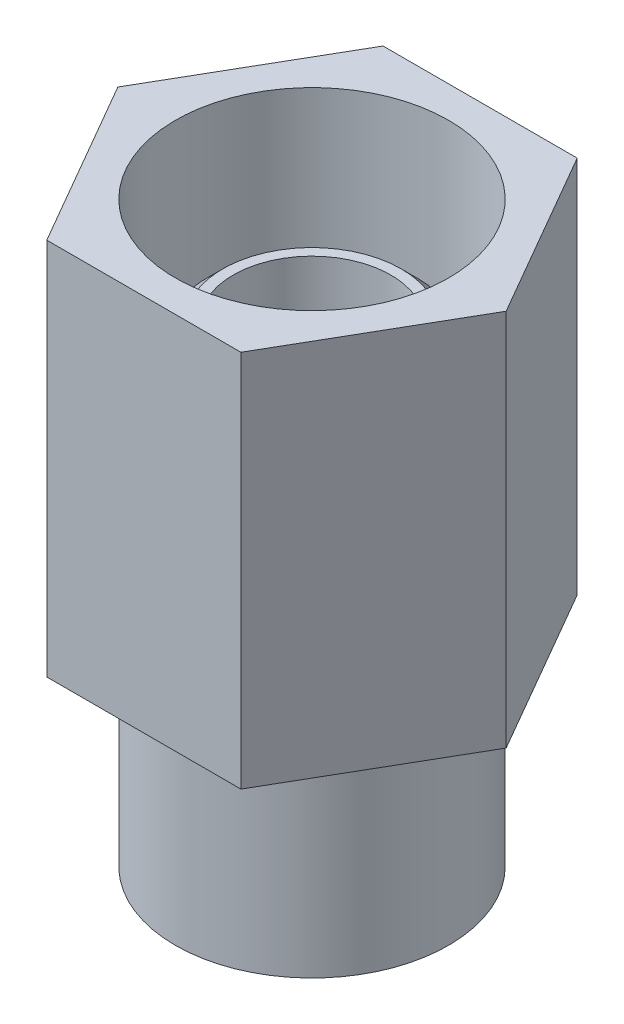
ISO-10303-21;
HEADER;
FILE_DESCRIPTION(('STEP AP214'),'2;1');
FILE_NAME('part.step','',(''),(''),'','','');
FILE_SCHEMA(('AUTOMOTIVE_DESIGN { 1 0 10303 214 1 1 1 1 }'));
ENDSEC;
DATA;
#1=APPLICATION_CONTEXT('core data for automotive mechanical design processes');
#2=APPLICATION_PROTOCOL_DEFINITION('international standard','automotive_design',2000,#1);
#3=PRODUCT_CONTEXT('',#1,'mechanical');
#4=PRODUCT('Part','Part','',(#3));
#5=PRODUCT_RELATED_PRODUCT_CATEGORY('part','',(#4));
#6=PRODUCT_DEFINITION_FORMATION('','',#4);
#7=PRODUCT_DEFINITION_CONTEXT('part definition',#1,'design');
#8=PRODUCT_DEFINITION('design','',#6,#7);
#9=PRODUCT_DEFINITION_SHAPE('','',#8);
#10=(LENGTH_UNIT() NAMED_UNIT(*) SI_UNIT(.MILLI.,.METRE.));
#11=(NAMED_UNIT(*) PLANE_ANGLE_UNIT() SI_UNIT($,.RADIAN.));
#12=(NAMED_UNIT(*) SI_UNIT($,.STERADIAN.) SOLID_ANGLE_UNIT());
#13=UNCERTAINTY_MEASURE_WITH_UNIT(LENGTH_MEASURE(1.E-05),#10,'distance_accuracy_value','');
#14=(GEOMETRIC_REPRESENTATION_CONTEXT(3) GLOBAL_UNCERTAINTY_ASSIGNED_CONTEXT((#13)) GLOBAL_UNIT_ASSIGNED_CONTEXT((#10,
#11,#12)) REPRESENTATION_CONTEXT('',''));
#15=CARTESIAN_POINT('',(0.,0.,0.));
#16=DIRECTION('',(0.,0.,1.));
#17=DIRECTION('',(1.,0.,0.));
#18=AXIS2_PLACEMENT_3D('',#15,#16,#17);
#19=CARTESIAN_POINT('',(0.,35.,0.));
#20=DIRECTION('',(0.,1.,0.));
#21=DIRECTION('',(0.,0.,1.));
#22=AXIS2_PLACEMENT_3D('',#19,#20,#21);
#23=PLANE('',#22);
#24=CARTESIAN_POINT('',(0.,35.,0.));
#25=DIRECTION('',(0.,1.,0.));
#26=DIRECTION('',(0.,0.,1.));
#27=AXIS2_PLACEMENT_3D('',#24,#25,#26);
#28=CIRCLE('',#27,10.);
#29=CARTESIAN_POINT('',(0.,35.,10.));
#30=VERTEX_POINT('',#29);
#31=EDGE_CURVE('E127',#30,#30,#28,.F.);
#32=ORIENTED_EDGE('',*,*,#31,.T.);
#33=EDGE_LOOP('',(#32));
#34=FACE_BOUND('',#33,.T.);
#35=CARTESIAN_POINT('',(0.,35.,0.));
#36=DIRECTION('',(0.,1.,0.));
#37=DIRECTION('',(0.,0.,1.));
#38=AXIS2_PLACEMENT_3D('',#35,#36,#37);
#39=CIRCLE('',#38,13.);
#40=CARTESIAN_POINT('',(0.,35.,-13.));
#41=VERTEX_POINT('',#40);
#42=EDGE_CURVE('E199',#41,#41,#39,.F.);
#43=ORIENTED_EDGE('',*,*,#42,.F.);
#44=EDGE_LOOP('',(#43));
#45=FACE_BOUND('',#44,.T.);
#46=ADVANCED_FACE('F49',(#34,#45),#23,.T.);
#47=CARTESIAN_POINT('',(0.,19.,0.));
#48=DIRECTION('',(0.,-1.,0.));
#49=DIRECTION('',(0.,0.,-1.));
#50=AXIS2_PLACEMENT_3D('',#47,#48,#49);
#51=CYLINDRICAL_SURFACE('',#50,7.5);
#52=CARTESIAN_POINT('',(0.,4.50000000000001,0.));
#53=DIRECTION('',(0.,1.,0.));
#54=DIRECTION('',(0.,0.,1.));
#55=AXIS2_PLACEMENT_3D('',#52,#53,#54);
#56=CIRCLE('',#55,7.5);
#57=CARTESIAN_POINT('',(0.,4.50000000000001,7.5));
#58=VERTEX_POINT('',#57);
#59=EDGE_CURVE('E195',#58,#58,#56,.F.);
#60=ORIENTED_EDGE('',*,*,#59,.T.);
#61=EDGE_LOOP('',(#60));
#62=FACE_BOUND('',#61,.T.);
#63=CARTESIAN_POINT('',(0.,45.,0.));
#64=DIRECTION('',(0.,1.,0.));
#65=DIRECTION('',(0.,0.,1.));
#66=AXIS2_PLACEMENT_3D('',#63,#64,#65);
#67=CIRCLE('',#66,7.5);
#68=CARTESIAN_POINT('',(0.,45.,7.5));
#69=VERTEX_POINT('',#68);
#70=EDGE_CURVE('E131',#69,#69,#67,.T.);
#71=ORIENTED_EDGE('',*,*,#70,.T.);
#72=EDGE_LOOP('',(#71));
#73=FACE_BOUND('',#72,.T.);
#74=ADVANCED_FACE('F218',(#62,#73),#51,.F.);
#75=CARTESIAN_POINT('',(0.,19.,0.));
#76=DIRECTION('',(0.,-1.,0.));
#77=DIRECTION('',(0.,0.,-1.));
#78=AXIS2_PLACEMENT_3D('',#75,#76,#77);
#79=CYLINDRICAL_SURFACE('',#78,13.);
#80=CARTESIAN_POINT('',(0.,19.,0.));
#81=DIRECTION('',(0.,1.,0.));
#82=DIRECTION('',(0.,0.,1.));
#83=AXIS2_PLACEMENT_3D('',#80,#81,#82);
#84=CIRCLE('',#83,13.);
#85=CARTESIAN_POINT('',(0.,19.,13.));
#86=VERTEX_POINT('',#85);
#87=EDGE_CURVE('E184',#86,#86,#84,.T.);
#88=ORIENTED_EDGE('',*,*,#87,.F.);
#89=EDGE_LOOP('',(#88));
#90=FACE_BOUND('',#89,.T.);
#91=CARTESIAN_POINT('',(0.,0.,0.));
#92=DIRECTION('',(0.,1.,0.));
#93=DIRECTION('',(0.,0.,1.));
#94=AXIS2_PLACEMENT_3D('',#91,#92,#93);
#95=CIRCLE('',#94,13.);
#96=CARTESIAN_POINT('',(0.,0.,13.));
#97=VERTEX_POINT('',#96);
#98=EDGE_CURVE('E183',#97,#97,#95,.T.);
#99=ORIENTED_EDGE('',*,*,#98,.T.);
#100=EDGE_LOOP('',(#99));
#101=FACE_BOUND('',#100,.T.);
#102=ADVANCED_FACE('F224',(#90,#101),#79,.T.);
#103=CARTESIAN_POINT('',(0.,0.,0.));
#104=DIRECTION('',(0.,1.,0.));
#105=DIRECTION('',(0.,0.,1.));
#106=AXIS2_PLACEMENT_3D('',#103,#104,#105);
#107=PLANE('',#106);
#108=CARTESIAN_POINT('',(0.,0.,0.));
#109=DIRECTION('',(0.,1.,0.));
#110=DIRECTION('',(0.,0.,1.));
#111=AXIS2_PLACEMENT_3D('',#108,#109,#110);
#112=CIRCLE('',#111,12.);
#113=CARTESIAN_POINT('',(0.,0.,12.));
#114=VERTEX_POINT('',#113);
#115=EDGE_CURVE('E188',#114,#114,#112,.T.);
#116=ORIENTED_EDGE('',*,*,#115,.T.);
#117=EDGE_LOOP('',(#116));
#118=FACE_BOUND('',#117,.T.);
#119=ORIENTED_EDGE('',*,*,#98,.F.);
#120=EDGE_LOOP('',(#119));
#121=FACE_BOUND('',#120,.T.);
#122=ADVANCED_FACE('F257',(#118,#121),#107,.F.);
#123=CARTESIAN_POINT('',(0.,0.,0.));
#124=DIRECTION('',(0.,-1.,0.));
#125=DIRECTION('',(0.,0.,-1.));
#126=AXIS2_PLACEMENT_3D('',#123,#124,#125);
#127=CONICAL_SURFACE('',#126,12.,0.785398163397446);
#128=ORIENTED_EDGE('',*,*,#59,.F.);
#129=EDGE_LOOP('',(#128));
#130=FACE_BOUND('',#129,.T.);
#131=ORIENTED_EDGE('',*,*,#115,.F.);
#132=EDGE_LOOP('',(#131));
#133=FACE_BOUND('',#132,.T.);
#134=ADVANCED_FACE('F256',(#130,#133),#127,.F.);
#135=CARTESIAN_POINT('',(-13.856406460551,35.,8.));
#136=DIRECTION('',(0.866025403784439,0.,-0.5));
#137=DIRECTION('',(-0.5,0.,-0.866025403784439));
#138=AXIS2_PLACEMENT_3D('',#135,#136,#137);
#139=PLANE('',#138);
#140=DIRECTION('',(0.,-1.,0.));
#141=VECTOR('',#140,1.);
#142=CARTESIAN_POINT('',(-18.475208614068,35.,0.));
#143=LINE('',#142,#141);
#144=CARTESIAN_POINT('',(-18.475208614068,55.,0.));
#145=VERTEX_POINT('',#144);
#146=CARTESIAN_POINT('',(-18.475208614068,19.,0.));
#147=VERTEX_POINT('',#146);
#148=EDGE_CURVE('E66',#145,#147,#143,.T.);
#149=ORIENTED_EDGE('',*,*,#148,.T.);
#150=DIRECTION('',(0.5,0.,0.866025403784439));
#151=VECTOR('',#150,1.);
#152=CARTESIAN_POINT('',(-13.856406460551,19.,8.));
#153=LINE('',#152,#151);
#154=CARTESIAN_POINT('',(-9.23760430703401,19.,16.));
#155=VERTEX_POINT('',#154);
#156=EDGE_CURVE('E150',#147,#155,#153,.T.);
#157=ORIENTED_EDGE('',*,*,#156,.T.);
#158=DIRECTION('',(0.,-1.,0.));
#159=VECTOR('',#158,1.);
#160=CARTESIAN_POINT('',(-9.23760430703401,35.,16.));
#161=LINE('',#160,#159);
#162=CARTESIAN_POINT('',(-9.23760430703394,55.,16.));
#163=VERTEX_POINT('',#162);
#164=EDGE_CURVE('E113',#163,#155,#161,.T.);
#165=ORIENTED_EDGE('',*,*,#164,.F.);
#166=DIRECTION('',(0.500000000000003,0.,0.866025403784437));
#167=VECTOR('',#166,1.);
#168=CARTESIAN_POINT('',(-13.856406460551,55.,8.00000000000004));
#169=LINE('',#168,#167);
#170=EDGE_CURVE('E111',#145,#163,#169,.T.);
#171=ORIENTED_EDGE('',*,*,#170,.F.);
#172=EDGE_LOOP('',(#149,#157,#165,#171));
#173=FACE_BOUND('',#172,.T.);
#174=ADVANCED_FACE('F112',(#173),#139,.F.);
#175=CARTESIAN_POINT('',(0.,35.,16.));
#176=DIRECTION('',(0.,0.,-1.));
#177=DIRECTION('',(-1.,0.,0.));
#178=AXIS2_PLACEMENT_3D('',#175,#176,#177);
#179=PLANE('',#178);
#180=ORIENTED_EDGE('',*,*,#164,.T.);
#181=DIRECTION('',(1.,0.,0.));
#182=VECTOR('',#181,1.);
#183=CARTESIAN_POINT('',(0.,19.,16.));
#184=LINE('',#183,#182);
#185=CARTESIAN_POINT('',(9.23760430703402,19.,16.));
#186=VERTEX_POINT('',#185);
#187=EDGE_CURVE('E153',#155,#186,#184,.T.);
#188=ORIENTED_EDGE('',*,*,#187,.T.);
#189=DIRECTION('',(0.,-1.,0.));
#190=VECTOR('',#189,1.);
#191=CARTESIAN_POINT('',(9.23760430703402,35.,16.));
#192=LINE('',#191,#190);
#193=CARTESIAN_POINT('',(9.23760430703412,55.,15.9999999999999));
#194=VERTEX_POINT('',#193);
#195=EDGE_CURVE('E178',#194,#186,#192,.T.);
#196=ORIENTED_EDGE('',*,*,#195,.F.);
#197=DIRECTION('',(1.,0.,0.));
#198=VECTOR('',#197,1.);
#199=CARTESIAN_POINT('',(0.,55.,16.));
#200=LINE('',#199,#198);
#201=EDGE_CURVE('E118',#163,#194,#200,.T.);
#202=ORIENTED_EDGE('',*,*,#201,.F.);
#203=EDGE_LOOP('',(#180,#188,#196,#202));
#204=FACE_BOUND('',#203,.T.);
#205=ADVANCED_FACE('F249',(#204),#179,.F.);
#206=CARTESIAN_POINT('',(13.856406460551,35.,8.00000000000001));
#207=DIRECTION('',(-0.866025403784439,0.,-0.5));
#208=DIRECTION('',(-0.5,0.,0.866025403784439));
#209=AXIS2_PLACEMENT_3D('',#206,#207,#208);
#210=PLANE('',#209);
#211=ORIENTED_EDGE('',*,*,#195,.T.);
#212=DIRECTION('',(0.5,0.,-0.866025403784439));
#213=VECTOR('',#212,1.);
#214=CARTESIAN_POINT('',(13.856406460551,19.,8.00000000000001));
#215=LINE('',#214,#213);
#216=CARTESIAN_POINT('',(18.475208614068,19.,0.));
#217=VERTEX_POINT('',#216);
#218=EDGE_CURVE('E157',#186,#217,#215,.T.);
#219=ORIENTED_EDGE('',*,*,#218,.T.);
#220=DIRECTION('',(0.,-1.,0.));
#221=VECTOR('',#220,1.);
#222=CARTESIAN_POINT('',(18.475208614068,35.,0.));
#223=LINE('',#222,#221);
#224=CARTESIAN_POINT('',(18.475208614068,55.,-1.6826817716975E-13));
#225=VERTEX_POINT('',#224);
#226=EDGE_CURVE('E175',#225,#217,#223,.T.);
#227=ORIENTED_EDGE('',*,*,#226,.F.);
#228=DIRECTION('',(0.499999999999993,0.,-0.866025403784443));
#229=VECTOR('',#228,1.);
#230=CARTESIAN_POINT('',(13.8564064605511,55.,7.99999999999988));
#231=LINE('',#230,#229);
#232=EDGE_CURVE('E137',#194,#225,#231,.T.);
#233=ORIENTED_EDGE('',*,*,#232,.F.);
#234=EDGE_LOOP('',(#211,#219,#227,#233));
#235=FACE_BOUND('',#234,.T.);
#236=ADVANCED_FACE('F245',(#235),#210,.F.);
#237=CARTESIAN_POINT('',(13.856406460551,35.,-8.));
#238=DIRECTION('',(-0.866025403784439,0.,0.5));
#239=DIRECTION('',(0.5,0.,0.866025403784439));
#240=AXIS2_PLACEMENT_3D('',#237,#238,#239);
#241=PLANE('',#240);
#242=ORIENTED_EDGE('',*,*,#226,.T.);
#243=DIRECTION('',(-0.5,0.,-0.866025403784439));
#244=VECTOR('',#243,1.);
#245=CARTESIAN_POINT('',(13.856406460551,19.,-8.));
#246=LINE('',#245,#244);
#247=CARTESIAN_POINT('',(9.23760430703402,19.,-16.));
#248=VERTEX_POINT('',#247);
#249=EDGE_CURVE('E161',#217,#248,#246,.T.);
#250=ORIENTED_EDGE('',*,*,#249,.T.);
#251=DIRECTION('',(0.,-1.,0.));
#252=VECTOR('',#251,1.);
#253=CARTESIAN_POINT('',(9.23760430703402,35.,-16.));
#254=LINE('',#253,#252);
#255=CARTESIAN_POINT('',(9.23760430703383,55.,-16.0000000000001));
#256=VERTEX_POINT('',#255);
#257=EDGE_CURVE('E172',#256,#248,#254,.T.);
#258=ORIENTED_EDGE('',*,*,#257,.F.);
#259=DIRECTION('',(-0.500000000000009,0.,-0.866025403784434));
#260=VECTOR('',#259,1.);
#261=CARTESIAN_POINT('',(13.8564064605509,55.,-8.00000000000013));
#262=LINE('',#261,#260);
#263=EDGE_CURVE('E141',#225,#256,#262,.T.);
#264=ORIENTED_EDGE('',*,*,#263,.F.);
#265=EDGE_LOOP('',(#242,#250,#258,#264));
#266=FACE_BOUND('',#265,.T.);
#267=ADVANCED_FACE('F241',(#266),#241,.F.);
#268=CARTESIAN_POINT('',(0.,35.,-16.));
#269=DIRECTION('',(0.,0.,1.));
#270=DIRECTION('',(1.,0.,0.));
#271=AXIS2_PLACEMENT_3D('',#268,#269,#270);
#272=PLANE('',#271);
#273=ORIENTED_EDGE('',*,*,#257,.T.);
#274=DIRECTION('',(-1.,0.,0.));
#275=VECTOR('',#274,1.);
#276=CARTESIAN_POINT('',(0.,19.,-16.));
#277=LINE('',#276,#275);
#278=CARTESIAN_POINT('',(-9.23760430703401,19.,-16.));
#279=VERTEX_POINT('',#278);
#280=EDGE_CURVE('E165',#248,#279,#277,.T.);
#281=ORIENTED_EDGE('',*,*,#280,.T.);
#282=DIRECTION('',(0.,-1.,0.));
#283=VECTOR('',#282,1.);
#284=CARTESIAN_POINT('',(-9.23760430703401,35.,-16.));
#285=LINE('',#284,#283);
#286=CARTESIAN_POINT('',(-9.23760430703401,55.,-16.));
#287=VERTEX_POINT('',#286);
#288=EDGE_CURVE('E73',#287,#279,#285,.T.);
#289=ORIENTED_EDGE('',*,*,#288,.F.);
#290=DIRECTION('',(-1.,0.,0.));
#291=VECTOR('',#290,1.);
#292=CARTESIAN_POINT('',(0.,55.,-16.0000000000001));
#293=LINE('',#292,#291);
#294=EDGE_CURVE('E125',#256,#287,#293,.T.);
#295=ORIENTED_EDGE('',*,*,#294,.F.);
#296=EDGE_LOOP('',(#273,#281,#289,#295));
#297=FACE_BOUND('',#296,.T.);
#298=ADVANCED_FACE('F238',(#297),#272,.F.);
#299=CARTESIAN_POINT('',(-13.856406460551,35.,-8.));
#300=DIRECTION('',(0.866025403784439,0.,0.5));
#301=DIRECTION('',(0.5,0.,-0.866025403784439));
#302=AXIS2_PLACEMENT_3D('',#299,#300,#301);
#303=PLANE('',#302);
#304=ORIENTED_EDGE('',*,*,#288,.T.);
#305=DIRECTION('',(-0.5,0.,0.866025403784439));
#306=VECTOR('',#305,1.);
#307=CARTESIAN_POINT('',(-13.856406460551,19.,-8.));
#308=LINE('',#307,#306);
#309=EDGE_CURVE('E106',#279,#147,#308,.T.);
#310=ORIENTED_EDGE('',*,*,#309,.T.);
#311=ORIENTED_EDGE('',*,*,#148,.F.);
#312=DIRECTION('',(-0.499999999999999,0.,0.866025403784439));
#313=VECTOR('',#312,1.);
#314=CARTESIAN_POINT('',(-13.856406460551,55.,-7.99999999999998));
#315=LINE('',#314,#313);
#316=EDGE_CURVE('E104',#287,#145,#315,.T.);
#317=ORIENTED_EDGE('',*,*,#316,.F.);
#318=EDGE_LOOP('',(#304,#310,#311,#317));
#319=FACE_BOUND('',#318,.T.);
#320=ADVANCED_FACE('F102',(#319),#303,.F.);
#321=CARTESIAN_POINT('',(0.,19.,0.));
#322=DIRECTION('',(0.,1.,0.));
#323=DIRECTION('',(0.,0.,1.));
#324=AXIS2_PLACEMENT_3D('',#321,#322,#323);
#325=PLANE('',#324);
#326=ORIENTED_EDGE('',*,*,#87,.T.);
#327=EDGE_LOOP('',(#326));
#328=FACE_BOUND('',#327,.T.);
#329=ORIENTED_EDGE('',*,*,#156,.F.);
#330=ORIENTED_EDGE('',*,*,#309,.F.);
#331=ORIENTED_EDGE('',*,*,#280,.F.);
#332=ORIENTED_EDGE('',*,*,#249,.F.);
#333=ORIENTED_EDGE('',*,*,#218,.F.);
#334=ORIENTED_EDGE('',*,*,#187,.F.);
#335=EDGE_LOOP('',(#329,#330,#331,#332,#333,#334));
#336=FACE_BOUND('',#335,.T.);
#337=ADVANCED_FACE('F232',(#328,#336),#325,.F.);
#338=CARTESIAN_POINT('',(0.,55.,0.));
#339=DIRECTION('',(0.,-1.,0.));
#340=DIRECTION('',(0.,0.,-1.));
#341=AXIS2_PLACEMENT_3D('',#338,#339,#340);
#342=CYLINDRICAL_SURFACE('',#341,13.);
#343=CARTESIAN_POINT('',(0.,55.,0.));
#344=DIRECTION('',(0.,1.,0.));
#345=DIRECTION('',(0.,0.,1.));
#346=AXIS2_PLACEMENT_3D('',#343,#344,#345);
#347=CIRCLE('',#346,13.);
#348=CARTESIAN_POINT('',(0.,55.,-13.));
#349=VERTEX_POINT('',#348);
#350=EDGE_CURVE('E146',#349,#349,#347,.T.);
#351=CARTESIAN_POINT('',(0.,35.,-13.));
#352=CARTESIAN_POINT('',(0.,35.2083333333333,-13.));
#353=CARTESIAN_POINT('',(0.,35.4166666666667,-13.));
#354=CARTESIAN_POINT('',(0.,35.8333333333333,-13.));
#355=CARTESIAN_POINT('',(0.,36.0416666666667,-13.));
#356=CARTESIAN_POINT('',(0.,36.4583333333333,-13.));
#357=CARTESIAN_POINT('',(0.,36.6666666666667,-13.));
#358=CARTESIAN_POINT('',(0.,37.0833333333333,-13.));
#359=CARTESIAN_POINT('',(0.,37.2916666666667,-13.));
#360=CARTESIAN_POINT('',(0.,37.7083333333333,-13.));
#361=CARTESIAN_POINT('',(0.,37.9166666666667,-13.));
#362=CARTESIAN_POINT('',(0.,38.3333333333333,-13.));
#363=CARTESIAN_POINT('',(0.,38.5416666666667,-13.));
#364=CARTESIAN_POINT('',(0.,38.9583333333333,-13.));
#365=CARTESIAN_POINT('',(0.,39.1666666666667,-13.));
#366=CARTESIAN_POINT('',(0.,39.5833333333333,-13.));
#367=CARTESIAN_POINT('',(0.,39.7916666666667,-13.));
#368=CARTESIAN_POINT('',(0.,40.2083333333333,-13.));
#369=CARTESIAN_POINT('',(0.,40.4166666666667,-13.));
#370=CARTESIAN_POINT('',(0.,40.8333333333333,-13.));
#371=CARTESIAN_POINT('',(0.,41.0416666666667,-13.));
#372=CARTESIAN_POINT('',(0.,41.4583333333333,-13.));
#373=CARTESIAN_POINT('',(0.,41.6666666666667,-13.));
#374=CARTESIAN_POINT('',(0.,42.0833333333333,-13.));
#375=CARTESIAN_POINT('',(0.,42.2916666666667,-13.));
#376=CARTESIAN_POINT('',(0.,42.7083333333333,-13.));
#377=CARTESIAN_POINT('',(0.,42.9166666666667,-13.));
#378=CARTESIAN_POINT('',(0.,43.3333333333333,-13.));
#379=CARTESIAN_POINT('',(0.,43.5416666666667,-13.));
#380=CARTESIAN_POINT('',(0.,43.9583333333333,-13.));
#381=CARTESIAN_POINT('',(0.,44.1666666666667,-13.));
#382=CARTESIAN_POINT('',(0.,44.5833333333333,-13.));
#383=CARTESIAN_POINT('',(0.,44.7916666666667,-13.));
#384=CARTESIAN_POINT('',(0.,45.2083333333333,-13.));
#385=CARTESIAN_POINT('',(0.,45.4166666666667,-13.));
#386=CARTESIAN_POINT('',(0.,45.8333333333333,-13.));
#387=CARTESIAN_POINT('',(0.,46.0416666666667,-13.));
#388=CARTESIAN_POINT('',(0.,46.4583333333333,-13.));
#389=CARTESIAN_POINT('',(0.,46.6666666666667,-13.));
#390=CARTESIAN_POINT('',(0.,47.0833333333333,-13.));
#391=CARTESIAN_POINT('',(0.,47.2916666666667,-13.));
#392=CARTESIAN_POINT('',(0.,47.7083333333333,-13.));
#393=CARTESIAN_POINT('',(0.,47.9166666666667,-13.));
#394=CARTESIAN_POINT('',(0.,48.3333333333333,-13.));
#395=CARTESIAN_POINT('',(0.,48.5416666666667,-13.));
#396=CARTESIAN_POINT('',(0.,48.9583333333333,-13.));
#397=CARTESIAN_POINT('',(0.,49.1666666666667,-13.));
#398=CARTESIAN_POINT('',(0.,49.5833333333333,-13.));
#399=CARTESIAN_POINT('',(0.,49.7916666666667,-13.));
#400=CARTESIAN_POINT('',(0.,50.2083333333333,-13.));
#401=CARTESIAN_POINT('',(0.,50.4166666666667,-13.));
#402=CARTESIAN_POINT('',(0.,50.8333333333333,-13.));
#403=CARTESIAN_POINT('',(0.,51.0416666666667,-13.));
#404=CARTESIAN_POINT('',(0.,51.4583333333333,-13.));
#405=CARTESIAN_POINT('',(0.,51.6666666666667,-13.));
#406=CARTESIAN_POINT('',(0.,52.0833333333333,-13.));
#407=CARTESIAN_POINT('',(0.,52.2916666666667,-13.));
#408=CARTESIAN_POINT('',(0.,52.7083333333333,-13.));
#409=CARTESIAN_POINT('',(0.,52.9166666666667,-13.));
#410=CARTESIAN_POINT('',(0.,53.3333333333333,-13.));
#411=CARTESIAN_POINT('',(0.,53.5416666666667,-13.));
#412=CARTESIAN_POINT('',(0.,53.9583333333333,-13.));
#413=CARTESIAN_POINT('',(0.,54.1666666666667,-13.));
#414=CARTESIAN_POINT('',(0.,54.5833333333333,-13.));
#415=CARTESIAN_POINT('',(0.,54.7916666666667,-13.));
#416=CARTESIAN_POINT('',(0.,55.,-13.));
#417=B_SPLINE_CURVE_WITH_KNOTS('',3,(#351,#352,#353,#354,#355,#356,#357,#358,#359,#360,#361,
#362,#363,#364,#365,#366,#367,#368,#369,#370,#371,#372,#373,#374,#375,#376,#377,#378,#379,#380,
#381,#382,#383,#384,#385,#386,#387,#388,#389,#390,#391,#392,#393,#394,#395,#396,#397,#398,#399,
#400,#401,#402,#403,#404,#405,#406,#407,#408,#409,#410,#411,#412,#413,#414,#415,#416),
.UNSPECIFIED.,.F.,.F.,(4,2,2,2,2,2,2,2,2,2,2,2,2,2,2,2,2,2,2,2,2,2,2,2,2,2,2,2,2,2,2,2,4),(0.,
0.625000000000001,1.25,1.875,2.5,3.125,3.75,4.375,5.,5.62499999999999,6.24999999999999,
6.87499999999999,7.49999999999999,8.12499999999999,8.74999999999999,9.37499999999999,
9.99999999999999,10.625,11.25,11.875,12.5,13.125,13.75,14.375,15.,15.625,16.25,16.875,17.5,
18.125,18.75,19.375,20.),.UNSPECIFIED.);
#418=EDGE_CURVE('BSEAM230',#41,#349,#417,.T.);
#419=ORIENTED_EDGE('',*,*,#42,.T.);
#420=ORIENTED_EDGE('',*,*,#350,.T.);
#421=ORIENTED_EDGE('',*,*,#418,.T.);
#422=ORIENTED_EDGE('',*,*,#418,.F.);
#423=EDGE_LOOP('',(#419,#421,#420,#422));
#424=FACE_BOUND('',#423,.T.);
#425=ADVANCED_FACE('F230',(#424),#342,.F.);
#426=CARTESIAN_POINT('',(0.,55.,0.));
#427=DIRECTION('',(0.,1.,0.));
#428=DIRECTION('',(0.,0.,1.));
#429=AXIS2_PLACEMENT_3D('',#426,#427,#428);
#430=PLANE('',#429);
#431=ORIENTED_EDGE('',*,*,#316,.T.);
#432=ORIENTED_EDGE('',*,*,#170,.T.);
#433=ORIENTED_EDGE('',*,*,#201,.T.);
#434=ORIENTED_EDGE('',*,*,#232,.T.);
#435=ORIENTED_EDGE('',*,*,#263,.T.);
#436=ORIENTED_EDGE('',*,*,#294,.T.);
#437=EDGE_LOOP('',(#431,#432,#433,#434,#435,#436));
#438=FACE_BOUND('',#437,.T.);
#439=ORIENTED_EDGE('',*,*,#350,.F.);
#440=EDGE_LOOP('',(#439));
#441=FACE_BOUND('',#440,.T.);
#442=ADVANCED_FACE('F121',(#438,#441),#430,.T.);
#443=CARTESIAN_POINT('',(0.,45.,0.));
#444=DIRECTION('',(0.,-1.,0.));
#445=DIRECTION('',(0.,0.,-1.));
#446=AXIS2_PLACEMENT_3D('',#443,#444,#445);
#447=CYLINDRICAL_SURFACE('',#446,10.);
#448=CARTESIAN_POINT('',(0.,43.5,0.));
#449=DIRECTION('',(0.,1.,0.));
#450=DIRECTION('',(0.,0.,1.));
#451=AXIS2_PLACEMENT_3D('',#448,#449,#450);
#452=CIRCLE('',#451,10.);
#453=CARTESIAN_POINT('',(0.,43.5,10.));
#454=VERTEX_POINT('',#453);
#455=EDGE_CURVE('E11',#454,#454,#452,.F.);
#456=ORIENTED_EDGE('',*,*,#455,.T.);
#457=EDGE_LOOP('',(#456));
#458=FACE_BOUND('',#457,.T.);
#459=ORIENTED_EDGE('',*,*,#31,.F.);
#460=EDGE_LOOP('',(#459));
#461=FACE_BOUND('',#460,.T.);
#462=ADVANCED_FACE('F214',(#458,#461),#447,.T.);
#463=CARTESIAN_POINT('',(0.,45.,0.));
#464=DIRECTION('',(0.,1.,0.));
#465=DIRECTION('',(0.,0.,1.));
#466=AXIS2_PLACEMENT_3D('',#463,#464,#465);
#467=PLANE('',#466);
#468=CARTESIAN_POINT('',(0.,45.,0.));
#469=DIRECTION('',(0.,1.,0.));
#470=DIRECTION('',(0.,0.,1.));
#471=AXIS2_PLACEMENT_3D('',#468,#469,#470);
#472=CIRCLE('',#471,8.5);
#473=CARTESIAN_POINT('',(0.,45.,8.5));
#474=VERTEX_POINT('',#473);
#475=EDGE_CURVE('E59',#474,#474,#472,.T.);
#476=ORIENTED_EDGE('',*,*,#475,.T.);
#477=EDGE_LOOP('',(#476));
#478=FACE_BOUND('',#477,.T.);
#479=ORIENTED_EDGE('',*,*,#70,.F.);
#480=EDGE_LOOP('',(#479));
#481=FACE_BOUND('',#480,.T.);
#482=ADVANCED_FACE('F206',(#478,#481),#467,.T.);
#483=CARTESIAN_POINT('',(0.,45.,0.));
#484=DIRECTION('',(0.,-1.,0.));
#485=DIRECTION('',(0.,0.,-1.));
#486=AXIS2_PLACEMENT_3D('',#483,#484,#485);
#487=CONICAL_SURFACE('',#486,8.5,0.785398163397448);
#488=ORIENTED_EDGE('',*,*,#455,.F.);
#489=EDGE_LOOP('',(#488));
#490=FACE_BOUND('',#489,.T.);
#491=ORIENTED_EDGE('',*,*,#475,.F.);
#492=EDGE_LOOP('',(#491));
#493=FACE_BOUND('',#492,.T.);
#494=ADVANCED_FACE('F52',(#490,#493),#487,.T.);
#495=CLOSED_SHELL('',(#46,#74,#102,#122,#134,#174,#205,#236,#267,#298,#320,#337,#425,#442,#462,
#482,#494));
#496=MANIFOLD_SOLID_BREP('B2',#495);
#497=ADVANCED_BREP_SHAPE_REPRESENTATION('',(#18,#496),#14);
#498=SHAPE_DEFINITION_REPRESENTATION(#9,#497);
ENDSEC;
END-ISO-10303-21;
